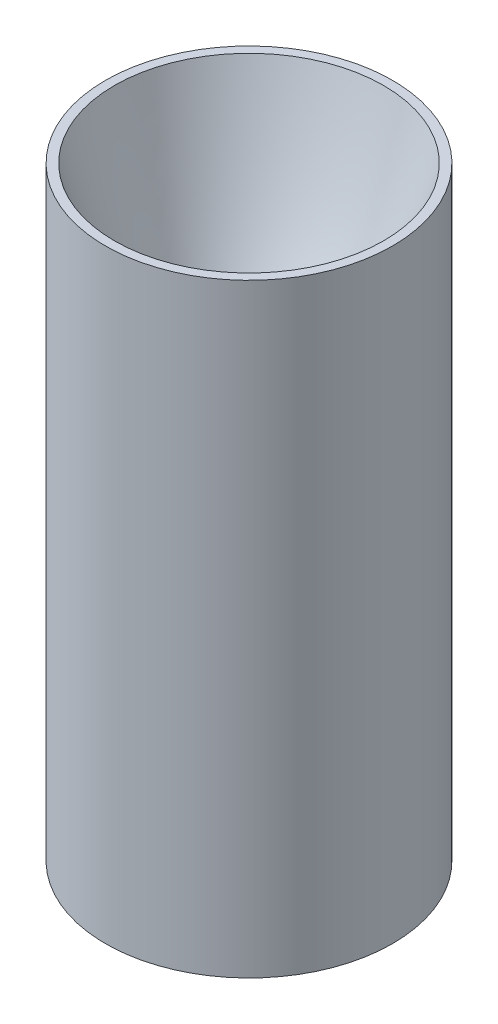
ISO-10303-21;
HEADER;
FILE_DESCRIPTION(('STEP AP214'),'2;1');
FILE_NAME('part.step','',(''),(''),'','','');
FILE_SCHEMA(('AUTOMOTIVE_DESIGN { 1 0 10303 214 1 1 1 1 }'));
ENDSEC;
DATA;
#1=APPLICATION_CONTEXT('core data for automotive mechanical design processes');
#2=APPLICATION_PROTOCOL_DEFINITION('international standard','automotive_design',2000,#1);
#3=PRODUCT_CONTEXT('',#1,'mechanical');
#4=PRODUCT('Part','Part','',(#3));
#5=PRODUCT_RELATED_PRODUCT_CATEGORY('part','',(#4));
#6=PRODUCT_DEFINITION_FORMATION('','',#4);
#7=PRODUCT_DEFINITION_CONTEXT('part definition',#1,'design');
#8=PRODUCT_DEFINITION('design','',#6,#7);
#9=PRODUCT_DEFINITION_SHAPE('','',#8);
#10=(LENGTH_UNIT() NAMED_UNIT(*) SI_UNIT(.MILLI.,.METRE.));
#11=(NAMED_UNIT(*) PLANE_ANGLE_UNIT() SI_UNIT($,.RADIAN.));
#12=(NAMED_UNIT(*) SI_UNIT($,.STERADIAN.) SOLID_ANGLE_UNIT());
#13=UNCERTAINTY_MEASURE_WITH_UNIT(LENGTH_MEASURE(1.E-05),#10,'distance_accuracy_value','');
#14=(GEOMETRIC_REPRESENTATION_CONTEXT(3) GLOBAL_UNCERTAINTY_ASSIGNED_CONTEXT((#13)) GLOBAL_UNIT_ASSIGNED_CONTEXT((#10,
#11,#12)) REPRESENTATION_CONTEXT('',''));
#15=CARTESIAN_POINT('',(0.,0.,0.));
#16=DIRECTION('',(0.,0.,1.));
#17=DIRECTION('',(1.,0.,0.));
#18=AXIS2_PLACEMENT_3D('',#15,#16,#17);
#19=CARTESIAN_POINT('',(26.7952792027638,6.50940032261705,0.));
#20=CARTESIAN_POINT('',(26.7445202608389,6.45863951352258,0.));
#21=CARTESIAN_POINT('',(26.6704420702071,6.38228245129657,0.));
#22=CARTESIAN_POINT('',(26.5045552478799,6.20880231838131,0.));
#23=CARTESIAN_POINT('',(26.3663457558084,6.0501123088261,0.));
#24=CARTESIAN_POINT('',(26.1788763741962,5.83307431955689,0.));
#25=CARTESIAN_POINT('',(26.0044054743904,5.61088821502492,0.));
#26=CARTESIAN_POINT('',(25.7917882699891,5.32567960819241,0.));
#27=CARTESIAN_POINT('',(25.6025147209982,5.0458645334822,0.));
#28=CARTESIAN_POINT('',(25.41648850457,4.75146224774109,0.));
#29=CARTESIAN_POINT('',(25.2460122224941,4.45494379501456,0.));
#30=CARTESIAN_POINT('',(25.0840703005529,4.14944285659226,0.));
#31=CARTESIAN_POINT('',(24.935285976811,3.8398274049797,0.));
#32=CARTESIAN_POINT('',(24.7971967711735,3.52378782945289,0.));
#33=CARTESIAN_POINT('',(24.6716190705559,3.20350771325653,0.));
#34=CARTESIAN_POINT('',(24.5577414131155,2.87825331698411,0.));
#35=CARTESIAN_POINT('',(24.4563235712815,2.54940009295196,0.));
#36=CARTESIAN_POINT('',(24.3671416013245,2.21651509223236,0.));
#37=CARTESIAN_POINT('',(24.2905437014453,1.88115744920019,0.));
#38=CARTESIAN_POINT('',(24.2264993053653,1.54221117006489,0.));
#39=CARTESIAN_POINT('',(24.1751847188441,1.20269794512489,0.));
#40=CARTESIAN_POINT('',(24.1414350870908,0.90159400009664,0.));
#41=CARTESIAN_POINT('',(24.1205335987741,0.646924938525799,0.));
#42=CARTESIAN_POINT('',(24.1084615678794,0.427224789349872,0.));
#43=CARTESIAN_POINT('',(24.1020237227721,0.267801741635842,0.));
#44=CARTESIAN_POINT('',(24.099606331446,0.110274361763279,0.));
#45=CARTESIAN_POINT('',(24.0990685004946,0.0360533244193808,0.));
#46=CARTESIAN_POINT('',(24.0990678740505,0.000160672239889663,0.));
#47=B_SPLINE_CURVE_WITH_KNOTS('',4,(#19,#20,#21,#22,#23,#24,#25,#26,#27,#28,#29,#30,#31,#32,#33,
#34,#35,#36,#37,#38,#39,#40,#41,#42,#43,#44,#45,#46),.UNSPECIFIED.,.F.,.F.,(5,1,1,1,1,1,1,1,1,1,
1,1,1,1,1,1,1,1,1,1,1,1,1,1,5),(0.0825688161645696,0.122284452541055,0.142142270729318,
0.162000088917581,0.201715725294151,0.241431361670644,0.281146998047181,0.320862634423759,
0.360578270800262,0.400293907176806,0.440009543553384,0.479725179929891,0.519440816306429,
0.55915645268299,0.598872089059496,0.638587725436031,0.678303361812587,0.718018998189109,
0.75773463456565,0.797450270942201,0.837165907318734,0.857023725507005,0.876881543695275,
0.896739361883545,0.916597180071815),.UNSPECIFIED.);
#48=CARTESIAN_POINT('',(-0.00553212594954357,165.815985113531,0.));
#49=DIRECTION('',(0.,1.,0.));
#50=AXIS1_PLACEMENT('',#48,#49);
#51=SURFACE_OF_REVOLUTION('',#47,#50);
#52=CARTESIAN_POINT('',(-0.00553212594953341,0.000160668806897801,0.));
#53=DIRECTION('',(0.,1.,0.));
#54=DIRECTION('',(-1.,0.,0.));
#55=AXIS2_PLACEMENT_3D('',#52,#53,#54);
#56=CIRCLE('',#55,24.1046000000001);
#57=CARTESIAN_POINT('',(-24.1101321259496,0.000160668806896325,0.));
#58=VERTEX_POINT('',#57);
#59=EDGE_CURVE('E11',#58,#58,#56,.T.);
#60=ORIENTED_EDGE('',*,*,#59,.F.);
#61=EDGE_LOOP('',(#60));
#62=FACE_BOUND('',#61,.T.);
#63=CARTESIAN_POINT('',(-0.00553212594953381,6.50940032262515,0.));
#64=DIRECTION('',(0.,1.,0.));
#65=DIRECTION('',(-1.,0.,0.));
#66=AXIS2_PLACEMENT_3D('',#63,#64,#65);
#67=CIRCLE('',#66,26.8008113287012);
#68=CARTESIAN_POINT('',(-26.8063434546508,6.50940032262515,0.));
#69=VERTEX_POINT('',#68);
#70=EDGE_CURVE('E119',#69,#69,#67,.T.);
#71=ORIENTED_EDGE('',*,*,#70,.T.);
#72=EDGE_LOOP('',(#71));
#73=FACE_BOUND('',#72,.T.);
#74=ADVANCED_FACE('F43',(#62,#73),#51,.T.);
#75=CARTESIAN_POINT('',(24.0990678740505,0.000160668806908237,0.));
#76=CARTESIAN_POINT('',(24.0990691047264,-0.0703679737352121,0.));
#77=CARTESIAN_POINT('',(24.0995982518238,-0.213423516364572,0.));
#78=CARTESIAN_POINT('',(24.1019739368555,-0.54302224256361,0.));
#79=CARTESIAN_POINT('',(24.108298330907,-0.823999723304706,0.));
#80=CARTESIAN_POINT('',(24.1177834518131,-1.19466139823137,0.));
#81=CARTESIAN_POINT('',(24.1304257444764,-1.51327438485323,0.));
#82=CARTESIAN_POINT('',(24.1462259682127,-1.86177892979882,0.));
#83=CARTESIAN_POINT('',(24.1651812265557,-2.19354619837348,0.));
#84=CARTESIAN_POINT('',(24.1928188404899,-2.61790872656857,0.));
#85=CARTESIAN_POINT('',(24.2322870469681,-3.12187327355973,0.));
#86=CARTESIAN_POINT('',(24.3032997069299,-3.87981800184723,0.));
#87=CARTESIAN_POINT('',(24.4231266778129,-4.88628971541376,0.));
#88=CARTESIAN_POINT('',(24.5994860436425,-6.05655008801696,0.));
#89=CARTESIAN_POINT('',(24.8508852327055,-7.38500574307494,0.));
#90=CARTESIAN_POINT('',(25.1517953130835,-8.7034138434872,0.));
#91=CARTESIAN_POINT('',(25.5017706231346,-10.0094765384076,0.));
#92=CARTESIAN_POINT('',(25.9003609832371,-11.3016589273833,0.));
#93=CARTESIAN_POINT('',(26.3469453915683,-12.5779386666623,0.));
#94=CARTESIAN_POINT('',(26.8410033225458,-13.8367268168494,0.));
#95=CARTESIAN_POINT('',(27.3816731216984,-15.0760364628828,0.));
#96=CARTESIAN_POINT('',(27.9684793864403,-16.2944491292128,0.));
#97=CARTESIAN_POINT('',(28.6001393975275,-17.4897781307818,0.));
#98=CARTESIAN_POINT('',(29.2765323957794,-18.6611270954326,0.));
#99=CARTESIAN_POINT('',(29.9954451018022,-19.8055827365355,0.));
#100=CARTESIAN_POINT('',(30.7580219993831,-20.9236994165562,0.));
#101=CARTESIAN_POINT('',(31.4591671926042,-21.8742511036734,0.));
#102=CARTESIAN_POINT('',(32.088736122994,-22.6732848253228,0.));
#103=CARTESIAN_POINT('',(32.6241284164022,-23.3202614843186,0.));
#104=CARTESIAN_POINT('',(33.0722557680798,-23.8398443636278,0.));
#105=CARTESIAN_POINT('',(33.5084500261274,-24.3296555943667,0.));
#106=CARTESIAN_POINT('',(33.9358261213152,-24.7883237389104,0.));
#107=CARTESIAN_POINT('',(34.2455586397423,-25.1137076600497,0.));
#108=CARTESIAN_POINT('',(34.536859957545,-25.4094883973448,0.));
#109=CARTESIAN_POINT('',(34.6364124254986,-25.5097892828568,0.));
#110=CARTESIAN_POINT('',(34.6862828032075,-25.5596614679656,0.));
#111=B_SPLINE_CURVE_WITH_KNOTS('',4,(#75,#76,#77,#78,#79,#80,#81,#82,#83,#84,#85,#86,#87,#88,
#89,#90,#91,#92,#93,#94,#95,#96,#97,#98,#99,#100,#101,#102,#103,#104,#105,#106,#107,#108,#109,
#110),.UNSPECIFIED.,.F.,.F.,(5,1,1,1,1,1,1,1,1,1,1,1,1,1,1,1,1,1,1,1,1,1,1,1,1,1,1,1,1,1,1,1,5),
(0.0826377293963901,0.0925749264345495,0.10251212335078,0.11244932026701,0.122386517183241,
0.132323714099471,0.142260911015702,0.152198107931932,0.162135304848163,0.182009698680624,
0.201884092513085,0.241632880178006,0.281381667842927,0.321130455507848,0.360879243172768,
0.400628030837689,0.44037681850261,0.480125606167531,0.519874393832452,0.559623181497373,
0.599371969162294,0.639120756827214,0.678869544492136,0.718618332157059,0.758367119821983,
0.798115907486907,0.817990301319368,0.837864695151829,0.857739088984291,0.877613482816753,
0.897487876649217,0.907425073565449,0.917362270357466),.UNSPECIFIED.);
#112=CARTESIAN_POINT('',(-0.00553212594954357,165.815985113531,0.));
#113=DIRECTION('',(0.,1.,0.));
#114=AXIS1_PLACEMENT('',#112,#113);
#115=SURFACE_OF_REVOLUTION('',#111,#114);
#116=CARTESIAN_POINT('',(-0.00553212594953185,-25.5596614655476,0.));
#117=DIRECTION('',(0.,1.,0.));
#118=DIRECTION('',(-1.,0.,0.));
#119=AXIS2_PLACEMENT_3D('',#116,#117,#118);
#120=CIRCLE('',#119,34.6918149267068);
#121=CARTESIAN_POINT('',(-34.6973470526563,-25.5596614655476,0.));
#122=VERTEX_POINT('',#121);
#123=EDGE_CURVE('E52',#122,#122,#120,.T.);
#124=ORIENTED_EDGE('',*,*,#123,.F.);
#125=EDGE_LOOP('',(#124));
#126=FACE_BOUND('',#125,.T.);
#127=ORIENTED_EDGE('',*,*,#59,.T.);
#128=EDGE_LOOP('',(#127));
#129=FACE_BOUND('',#128,.T.);
#130=ADVANCED_FACE('F138',(#126,#129),#115,.T.);
#131=CARTESIAN_POINT('',(-0.00553212594953185,-25.5596614655476,0.));
#132=DIRECTION('',(0.,-1.,0.));
#133=DIRECTION('',(1.,0.,0.));
#134=AXIS2_PLACEMENT_3D('',#131,#132,#133);
#135=CONICAL_SURFACE('',#134,34.6918149267068,0.785398163436923);
#136=CARTESIAN_POINT('',(-0.00553212594953132,-34.1672896564155,0.));
#137=DIRECTION('',(0.,1.,0.));
#138=DIRECTION('',(-1.,0.,0.));
#139=AXIS2_PLACEMENT_3D('',#136,#137,#138);
#140=CIRCLE('',#139,43.2994431182542);
#141=CARTESIAN_POINT('',(-43.3049752442037,-34.1672896564155,0.));
#142=VERTEX_POINT('',#141);
#143=EDGE_CURVE('E196',#142,#142,#140,.T.);
#144=ORIENTED_EDGE('',*,*,#143,.F.);
#145=EDGE_LOOP('',(#144));
#146=FACE_BOUND('',#145,.T.);
#147=ORIENTED_EDGE('',*,*,#123,.T.);
#148=EDGE_LOOP('',(#147));
#149=FACE_BOUND('',#148,.T.);
#150=ADVANCED_FACE('F141',(#146,#149),#135,.F.);
#151=CARTESIAN_POINT('',(43.2939109923046,-34.1672896564155,0.));
#152=CARTESIAN_POINT('',(43.3437831513223,-34.2171620551714,0.));
#153=CARTESIAN_POINT('',(43.4443920727492,-34.3185162876524,0.));
#154=CARTESIAN_POINT('',(43.6740724065625,-34.5515494508273,0.));
#155=CARTESIAN_POINT('',(43.8739246242924,-34.7603401511495,0.));
#156=CARTESIAN_POINT('',(44.1814575029394,-35.0846311851452,0.));
#157=CARTESIAN_POINT('',(44.5147761897921,-35.4469926571794,0.));
#158=CARTESIAN_POINT('',(44.9151269482091,-35.8942476326121,0.));
#159=CARTESIAN_POINT('',(45.3528176805606,-36.4033812820872,0.));
#160=CARTESIAN_POINT('',(45.8935379372936,-37.0556721225026,0.));
#161=CARTESIAN_POINT('',(46.5198690603663,-37.8514517850733,0.));
#162=CARTESIAN_POINT('',(47.2231021380089,-38.8040762391045,0.));
#163=CARTESIAN_POINT('',(47.9844755196269,-39.9209726571504,0.));
#164=CARTESIAN_POINT('',(48.7041252288017,-41.0661548789494,0.));
#165=CARTESIAN_POINT('',(49.3801202305322,-42.237093238969,0.));
#166=CARTESIAN_POINT('',(50.0120609277141,-43.4327015259013,0.));
#167=CARTESIAN_POINT('',(50.5987337525416,-44.6509688035954,0.));
#168=CARTESIAN_POINT('',(51.1395203608935,-45.8904084054128,0.));
#169=CARTESIAN_POINT('',(51.6335378309109,-47.1491350671244,0.));
#170=CARTESIAN_POINT('',(52.0243487391707,-48.2659692236755,0.));
#171=CARTESIAN_POINT('',(52.3292893402464,-49.2330777402432,0.));
#172=CARTESIAN_POINT('',(52.6100142242714,-50.2074890382386,0.));
#173=CARTESIAN_POINT('',(52.8663751202277,-51.1885390834316,0.));
#174=CARTESIAN_POINT('',(53.0920641868644,-52.1774428213628,0.));
#175=CARTESIAN_POINT('',(53.286810822161,-53.1724252398257,0.));
#176=CARTESIAN_POINT('',(53.4566757862888,-54.1724354302666,0.));
#177=CARTESIAN_POINT('',(53.5774268613503,-55.0081658604085,0.));
#178=CARTESIAN_POINT('',(53.6772884517024,-55.8484803658293,0.));
#179=CARTESIAN_POINT('',(53.7561931214081,-56.6879981651896,0.));
#180=CARTESIAN_POINT('',(53.8004052846286,-57.2809598991543,0.));
#181=CARTESIAN_POINT('',(53.8304176255881,-57.78159444267,0.));
#182=CARTESIAN_POINT('',(53.8501684533724,-58.2128376217517,0.));
#183=CARTESIAN_POINT('',(53.8628113509311,-58.532567487684,0.));
#184=CARTESIAN_POINT('',(53.8722968380062,-58.9047954926748,0.));
#185=CARTESIAN_POINT('',(53.8786214368661,-59.1815646164516,0.));
#186=CARTESIAN_POINT('',(53.8809972871444,-59.5154061029223,0.));
#187=CARTESIAN_POINT('',(53.8815264301114,-59.6569831565778,0.));
#188=CARTESIAN_POINT('',(53.881527661459,-59.7275132097554,0.));
#189=B_SPLINE_CURVE_WITH_KNOTS('',4,(#151,#152,#153,#154,#155,#156,#157,#158,#159,#160,#161,
#162,#163,#164,#165,#166,#167,#168,#169,#170,#171,#172,#173,#174,#175,#176,#177,#178,#179,#180,
#181,#182,#183,#184,#185,#186,#187,#188),.UNSPECIFIED.,.F.,.F.,(5,1,1,1,1,1,1,1,1,1,1,1,1,1,1,1,
1,1,1,1,1,1,1,1,1,1,1,1,1,1,1,1,1,1,5),(0.0826377290758682,0.092574925554141,0.102512122470373,
0.112449319386606,0.122386516302838,0.142260910135299,0.162135303967759,0.18200969780022,
0.201884091632681,0.241632879297603,0.281381666962524,0.321130454627446,0.360879242292367,
0.400628029957289,0.440376817622211,0.480125605287132,0.519874392952054,0.559623180616974,
0.599371968281896,0.619246362114357,0.639120755946818,0.67886954361174,0.718618331276661,
0.738492725109122,0.758367118941582,0.798115906606503,0.817990300438964,0.837864694271425,
0.857739088103886,0.867676285020117,0.877613481936347,0.887550678852578,0.897487875768808,
0.907425072685039,0.917362270043718),.UNSPECIFIED.);
#190=CARTESIAN_POINT('',(-0.00553212594954357,165.815985113531,0.));
#191=DIRECTION('',(0.,1.,0.));
#192=AXIS1_PLACEMENT('',#190,#191);
#193=SURFACE_OF_REVOLUTION('',#189,#192);
#194=CARTESIAN_POINT('',(-0.00553212594952976,-59.7275132222084,0.));
#195=DIRECTION('',(0.,1.,0.));
#196=DIRECTION('',(-1.,0.,0.));
#197=AXIS2_PLACEMENT_3D('',#194,#195,#196);
#198=CIRCLE('',#197,53.8870597874087);
#199=CARTESIAN_POINT('',(-53.8925919133582,-59.7275132222084,0.));
#200=VERTEX_POINT('',#199);
#201=EDGE_CURVE('E193',#200,#200,#198,.T.);
#202=ORIENTED_EDGE('',*,*,#201,.F.);
#203=EDGE_LOOP('',(#202));
#204=FACE_BOUND('',#203,.T.);
#205=ORIENTED_EDGE('',*,*,#143,.T.);
#206=EDGE_LOOP('',(#205));
#207=FACE_BOUND('',#206,.T.);
#208=ADVANCED_FACE('F145',(#204,#207),#193,.T.);
#209=CARTESIAN_POINT('',(-0.00553212594954357,165.815985113531,0.));
#210=DIRECTION('',(0.,1.,0.));
#211=DIRECTION('',(-1.,0.,0.));
#212=AXIS2_PLACEMENT_3D('',#209,#210,#211);
#213=CYLINDRICAL_SURFACE('',#212,53.8870597874087);
#214=CARTESIAN_POINT('',(-0.00553212594952042,-212.127513222208,0.));
#215=DIRECTION('',(0.,1.,0.));
#216=DIRECTION('',(-1.,0.,0.));
#217=AXIS2_PLACEMENT_3D('',#214,#215,#216);
#218=CIRCLE('',#217,53.8870597874087);
#219=CARTESIAN_POINT('',(-53.8925919133582,-212.127513222208,0.));
#220=VERTEX_POINT('',#219);
#221=EDGE_CURVE('E190',#220,#220,#218,.T.);
#222=ORIENTED_EDGE('',*,*,#221,.F.);
#223=EDGE_LOOP('',(#222));
#224=FACE_BOUND('',#223,.T.);
#225=ORIENTED_EDGE('',*,*,#201,.T.);
#226=EDGE_LOOP('',(#225));
#227=FACE_BOUND('',#226,.T.);
#228=ADVANCED_FACE('F149',(#224,#227),#213,.F.);
#229=CARTESIAN_POINT('',(76.4900236023066,-212.127513222208,0.));
#230=DIRECTION('',(0.,1.,0.));
#231=DIRECTION('',(-1.,0.,0.));
#232=AXIS2_PLACEMENT_3D('',#229,#230,#231);
#233=PLANE('',#232);
#234=CARTESIAN_POINT('',(46.1032838079609,-212.127513222208,46.1035512337718));
#235=DIRECTION('',(0.,1.,0.));
#236=DIRECTION('',(0.38268343232144,0.,-0.923879532529367));
#237=AXIS2_PLACEMENT_3D('',#234,#235,#236);
#238=ELLIPSE('',#237,4.21640000033001,4.21639999999999);
#239=CARTESIAN_POINT('',(47.7168302321273,-212.127513222208,42.20810557251));
#240=VERTEX_POINT('',#239);
#241=EDGE_CURVE('E47',#240,#240,#238,.T.);
#242=ORIENTED_EDGE('',*,*,#241,.T.);
#243=EDGE_LOOP('',(#242));
#244=FACE_BOUND('',#243,.T.);
#245=CARTESIAN_POINT('',(-0.000267431971473179,-212.127513222208,65.2002674406839));
#246=DIRECTION('',(0.,1.,0.));
#247=DIRECTION('',(0.707106781139304,0.,-0.707106781233791));
#248=AXIS2_PLACEMENT_3D('',#245,#246,#247);
#249=ELLIPSE('',#248,4.21640000112674,4.21639999999999);
#250=CARTESIAN_POINT('',(2.98117760082102,-212.127513222208,62.2188224074931));
#251=VERTEX_POINT('',#250);
#252=EDGE_CURVE('E93',#251,#251,#249,.T.);
#253=ORIENTED_EDGE('',*,*,#252,.T.);
#254=EDGE_LOOP('',(#253));
#255=FACE_BOUND('',#254,.T.);
#256=CARTESIAN_POINT('',(-46.1038186893277,-212.127513222208,46.1035512511962));
#257=DIRECTION('',(0.,1.,0.));
#258=DIRECTION('',(0.923879532493207,0.,-0.382683432408738));
#259=AXIS2_PLACEMENT_3D('',#256,#257,#258);
#260=ELLIPSE('',#259,4.21640000192348,4.21639999999999);
#261=CARTESIAN_POINT('',(-42.2083730267463,-212.127513222208,44.4900048260519));
#262=VERTEX_POINT('',#261);
#263=EDGE_CURVE('E97',#262,#262,#260,.T.);
#264=ORIENTED_EDGE('',*,*,#263,.T.);
#265=EDGE_LOOP('',(#264));
#266=FACE_BOUND('',#265,.T.);
#267=CARTESIAN_POINT('',(-65.2005348987914,-212.127513222208,0.));
#268=DIRECTION('',(0.,1.,0.));
#269=DIRECTION('',(1.,0.,0.));
#270=AXIS2_PLACEMENT_3D('',#267,#268,#269);
#271=ELLIPSE('',#270,4.21640000225349,4.21639999999999);
#272=CARTESIAN_POINT('',(-60.9841348965379,-212.127513222208,0.));
#273=VERTEX_POINT('',#272);
#274=EDGE_CURVE('E101',#273,#273,#271,.T.);
#275=ORIENTED_EDGE('',*,*,#274,.T.);
#276=EDGE_LOOP('',(#275));
#277=FACE_BOUND('',#276,.T.);
#278=CARTESIAN_POINT('',(-46.1038186893284,-212.127513222208,-46.1035512511956));
#279=DIRECTION('',(0.,1.,0.));
#280=DIRECTION('',(0.92387953249321,0.,0.382683432408731));
#281=AXIS2_PLACEMENT_3D('',#278,#279,#280);
#282=ELLIPSE('',#281,4.21640000192348,4.21639999999999);
#283=CARTESIAN_POINT('',(-42.2083730267469,-212.127513222208,-44.4900048260513));
#284=VERTEX_POINT('',#283);
#285=EDGE_CURVE('E105',#284,#284,#282,.T.);
#286=ORIENTED_EDGE('',*,*,#285,.T.);
#287=EDGE_LOOP('',(#286));
#288=FACE_BOUND('',#287,.T.);
#289=CARTESIAN_POINT('',(-0.000267431972383761,-212.127513222208,-65.2002674406839));
#290=DIRECTION('',(0.,1.,0.));
#291=DIRECTION('',(0.707106781139309,0.,0.707106781233786));
#292=AXIS2_PLACEMENT_3D('',#289,#290,#291);
#293=ELLIPSE('',#292,4.21640000112674,4.21639999999999);
#294=CARTESIAN_POINT('',(2.98117760082012,-212.127513222208,-62.2188224074931));
#295=VERTEX_POINT('',#294);
#296=EDGE_CURVE('E109',#295,#295,#293,.T.);
#297=ORIENTED_EDGE('',*,*,#296,.T.);
#298=EDGE_LOOP('',(#297));
#299=FACE_BOUND('',#298,.T.);
#300=CARTESIAN_POINT('',(46.1032838079602,-212.127513222208,-46.1035512337724));
#301=DIRECTION('',(0.,1.,0.));
#302=DIRECTION('',(0.382683432321446,0.,0.923879532529364));
#303=AXIS2_PLACEMENT_3D('',#300,#301,#302);
#304=ELLIPSE('',#303,4.21640000033001,4.21639999999999);
#305=CARTESIAN_POINT('',(47.7168302321267,-212.127513222208,-42.2081055725107));
#306=VERTEX_POINT('',#305);
#307=EDGE_CURVE('E113',#306,#306,#304,.T.);
#308=ORIENTED_EDGE('',*,*,#307,.T.);
#309=EDGE_LOOP('',(#308));
#310=FACE_BOUND('',#309,.T.);
#311=CARTESIAN_POINT('',(65.2,-212.127513222208,0.));
#312=DIRECTION('',(0.,-1.,0.));
#313=DIRECTION('',(0.,0.,-1.));
#314=AXIS2_PLACEMENT_3D('',#311,#312,#313);
#315=CIRCLE('',#314,4.21639999999999);
#316=CARTESIAN_POINT('',(65.2,-212.127513222208,-4.21639999999999));
#317=VERTEX_POINT('',#316);
#318=EDGE_CURVE('E114',#317,#317,#315,.T.);
#319=ORIENTED_EDGE('',*,*,#318,.F.);
#320=EDGE_LOOP('',(#319));
#321=FACE_BOUND('',#320,.T.);
#322=CARTESIAN_POINT('',(-0.00553212594952042,-212.127513222208,0.));
#323=DIRECTION('',(0.,1.,0.));
#324=DIRECTION('',(-1.,0.,0.));
#325=AXIS2_PLACEMENT_3D('',#322,#323,#324);
#326=CIRCLE('',#325,76.4955557282561);
#327=CARTESIAN_POINT('',(-76.5010878542056,-212.127513222208,0.));
#328=VERTEX_POINT('',#327);
#329=EDGE_CURVE('E187',#328,#328,#326,.T.);
#330=ORIENTED_EDGE('',*,*,#329,.F.);
#331=EDGE_LOOP('',(#330));
#332=FACE_BOUND('',#331,.T.);
#333=ORIENTED_EDGE('',*,*,#221,.T.);
#334=EDGE_LOOP('',(#333));
#335=FACE_BOUND('',#334,.T.);
#336=ADVANCED_FACE('F153',(#244,#255,#266,#277,#288,#299,#310,#321,#332,#335),#233,.F.);
#337=CARTESIAN_POINT('',(-0.00553212594954357,165.815985113531,0.));
#338=DIRECTION('',(0.,1.,0.));
#339=DIRECTION('',(-1.,0.,0.));
#340=AXIS2_PLACEMENT_3D('',#337,#338,#339);
#341=CYLINDRICAL_SURFACE('',#340,76.4955557282561);
#342=CARTESIAN_POINT('',(-0.00553212594954014,109.927507640521,0.));
#343=DIRECTION('',(0.,1.,0.));
#344=DIRECTION('',(-1.,0.,0.));
#345=AXIS2_PLACEMENT_3D('',#342,#343,#344);
#346=CIRCLE('',#345,76.4955557282561);
#347=CARTESIAN_POINT('',(-76.5010878542057,109.927507640521,0.));
#348=VERTEX_POINT('',#347);
#349=EDGE_CURVE('E184',#348,#348,#346,.T.);
#350=ORIENTED_EDGE('',*,*,#349,.F.);
#351=EDGE_LOOP('',(#350));
#352=FACE_BOUND('',#351,.T.);
#353=ORIENTED_EDGE('',*,*,#329,.T.);
#354=EDGE_LOOP('',(#353));
#355=FACE_BOUND('',#354,.T.);
#356=ADVANCED_FACE('F157',(#352,#355),#341,.T.);
#357=CARTESIAN_POINT('',(71.7275236023065,109.927507640521,0.));
#358=DIRECTION('',(0.,-1.,0.));
#359=DIRECTION('',(1.,0.,0.));
#360=AXIS2_PLACEMENT_3D('',#357,#358,#359);
#361=PLANE('',#360);
#362=CARTESIAN_POINT('',(-0.00553212594954014,109.927507640521,0.));
#363=DIRECTION('',(0.,1.,0.));
#364=DIRECTION('',(-1.,0.,0.));
#365=AXIS2_PLACEMENT_3D('',#362,#363,#364);
#366=CIRCLE('',#365,71.7330557282561);
#367=CARTESIAN_POINT('',(-71.7385878542057,109.927507640521,0.));
#368=VERTEX_POINT('',#367);
#369=EDGE_CURVE('E181',#368,#368,#366,.T.);
#370=ORIENTED_EDGE('',*,*,#369,.F.);
#371=EDGE_LOOP('',(#370));
#372=FACE_BOUND('',#371,.T.);
#373=ORIENTED_EDGE('',*,*,#349,.T.);
#374=EDGE_LOOP('',(#373));
#375=FACE_BOUND('',#374,.T.);
#376=ADVANCED_FACE('F161',(#372,#375),#361,.F.);
#377=CARTESIAN_POINT('',(71.7275236023066,109.927507640521,0.));
#378=CARTESIAN_POINT('',(49.2614014026307,34.6361148417855,0.));
#379=CARTESIAN_POINT('',(26.7952792027517,6.50940032262514,0.));
#380=B_SPLINE_CURVE_WITH_KNOTS('',2,(#377,#378,#379),.UNSPECIFIED.,.F.,.F.,(3,3),(0.,1.),.UNSPECIFIED.);
#381=CARTESIAN_POINT('',(-0.00553212594954357,165.815985113531,0.));
#382=DIRECTION('',(0.,1.,0.));
#383=AXIS1_PLACEMENT('',#381,#382);
#384=SURFACE_OF_REVOLUTION('',#380,#383);
#385=ORIENTED_EDGE('',*,*,#70,.F.);
#386=EDGE_LOOP('',(#385));
#387=FACE_BOUND('',#386,.T.);
#388=ORIENTED_EDGE('',*,*,#369,.T.);
#389=EDGE_LOOP('',(#388));
#390=FACE_BOUND('',#389,.T.);
#391=ADVANCED_FACE('F165',(#387,#390),#384,.T.);
#392=CARTESIAN_POINT('',(65.2,-187.127513222208,0.));
#393=DIRECTION('',(0.,-1.,0.));
#394=DIRECTION('',(0.,0.,-1.));
#395=AXIS2_PLACEMENT_3D('',#392,#393,#394);
#396=CONICAL_SURFACE('',#395,4.21639999999999,1.02974425867665);
#397=CARTESIAN_POINT('',(65.2,-184.594044508141,0.));
#398=VERTEX_POINT('',#397);
#399=VERTEX_LOOP('',#398);
#400=FACE_BOUND('',#399,.T.);
#401=CARTESIAN_POINT('',(65.2,-187.127513222208,0.));
#402=DIRECTION('',(0.,-1.,0.));
#403=DIRECTION('',(0.,0.,-1.));
#404=AXIS2_PLACEMENT_3D('',#401,#402,#403);
#405=CIRCLE('',#404,4.21639999999999);
#406=CARTESIAN_POINT('',(65.2,-187.127513222208,-4.21639999999999));
#407=VERTEX_POINT('',#406);
#408=EDGE_CURVE('E117',#407,#407,#405,.T.);
#409=ORIENTED_EDGE('',*,*,#408,.T.);
#410=EDGE_LOOP('',(#409));
#411=FACE_BOUND('',#410,.T.);
#412=ADVANCED_FACE('F169',(#400,#411),#396,.F.);
#413=CARTESIAN_POINT('',(65.2,-212.127513222208,0.));
#414=DIRECTION('',(0.,-1.,0.));
#415=DIRECTION('',(0.,0.,-1.));
#416=AXIS2_PLACEMENT_3D('',#413,#414,#415);
#417=CYLINDRICAL_SURFACE('',#416,4.21639999999999);
#418=ORIENTED_EDGE('',*,*,#408,.F.);
#419=EDGE_LOOP('',(#418));
#420=FACE_BOUND('',#419,.T.);
#421=ORIENTED_EDGE('',*,*,#318,.T.);
#422=EDGE_LOOP('',(#421));
#423=FACE_BOUND('',#422,.T.);
#424=ADVANCED_FACE('F294',(#420,#423),#417,.F.);
#425=CARTESIAN_POINT('',(46.1032838094549,-212.127825399818,-46.1035512301639));
#426=DIRECTION('',(4.78798051518147E-06,-0.99999999992173,1.15592074975258E-05));
#427=DIRECTION('',(0.,-1.15592074976583E-05,-0.999999999933193));
#428=AXIS2_PLACEMENT_3D('',#425,#426,#427);
#429=CYLINDRICAL_SURFACE('',#428,4.21639999999999);
#430=CARTESIAN_POINT('',(46.103164109942,-187.127825401775,-46.1038402103513));
#431=DIRECTION('',(4.78798051518147E-06,-0.99999999992173,1.15592074975258E-05));
#432=DIRECTION('',(0.,-1.15592074976583E-05,-0.999999999933193));
#433=AXIS2_PLACEMENT_3D('',#430,#431,#432);
#434=CIRCLE('',#433,4.2164);
#435=CARTESIAN_POINT('',(46.103164109942,-187.127874140018,-50.3202402100696));
#436=VERTEX_POINT('',#435);
#437=EDGE_CURVE('E110',#436,#436,#434,.T.);
#438=ORIENTED_EDGE('',*,*,#437,.F.);
#439=EDGE_LOOP('',(#438));
#440=FACE_BOUND('',#439,.T.);
#441=ORIENTED_EDGE('',*,*,#307,.F.);
#442=EDGE_LOOP('',(#441));
#443=FACE_BOUND('',#442,.T.);
#444=ADVANCED_FACE('F300',(#440,#443),#429,.F.);
#445=CARTESIAN_POINT('',(46.103164109942,-187.127825401775,-46.1038402103513));
#446=DIRECTION('',(4.78798051518147E-06,-0.99999999992173,1.15592074975258E-05));
#447=DIRECTION('',(0.,-1.15592074976583E-05,-0.999999999933193));
#448=AXIS2_PLACEMENT_3D('',#445,#446,#447);
#449=CONICAL_SURFACE('',#448,4.2164,1.02974425867665);
#450=CARTESIAN_POINT('',(46.1031519797432,-184.594356687906,-46.1038694952419));
#451=VERTEX_POINT('',#450);
#452=VERTEX_LOOP('',#451);
#453=FACE_BOUND('',#452,.T.);
#454=ORIENTED_EDGE('',*,*,#437,.T.);
#455=EDGE_LOOP('',(#454));
#456=FACE_BOUND('',#455,.T.);
#457=ADVANCED_FACE('F308',(#453,#456),#449,.F.);
#458=CARTESIAN_POINT('',(-0.000267414548880048,-212.128579063238,-65.2002674232604));
#459=DIRECTION('',(1.63471880111628E-05,-0.99999999973277,1.63471880132858E-05));
#460=DIRECTION('',(0.,-1.634718801547E-05,-0.999999999866385));
#461=AXIS2_PLACEMENT_3D('',#458,#459,#460);
#462=CYLINDRICAL_SURFACE('',#461,4.21639999999999);
#463=CARTESIAN_POINT('',(-0.000676094249159119,-187.128579069919,-65.2006761029608));
#464=DIRECTION('',(1.63471880111628E-05,-0.99999999973277,1.63471880132858E-05));
#465=DIRECTION('',(0.,-1.634718801547E-05,-0.999999999866385));
#466=AXIS2_PLACEMENT_3D('',#463,#464,#465);
#467=CIRCLE('',#466,4.2164);
#468=CARTESIAN_POINT('',(-0.000676094249159119,-187.128647996203,-69.4170761023974));
#469=VERTEX_POINT('',#468);
#470=EDGE_CURVE('E106',#469,#469,#467,.T.);
#471=ORIENTED_EDGE('',*,*,#470,.F.);
#472=EDGE_LOOP('',(#471));
#473=FACE_BOUND('',#472,.T.);
#474=ORIENTED_EDGE('',*,*,#296,.F.);
#475=EDGE_LOOP('',(#474));
#476=FACE_BOUND('',#475,.T.);
#477=ADVANCED_FACE('F317',(#473,#476),#462,.F.);
#478=CARTESIAN_POINT('',(-0.000676094249159119,-187.128579069919,-65.2006761029608));
#479=DIRECTION('',(1.63471880111628E-05,-0.99999999973277,1.63471880132858E-05));
#480=DIRECTION('',(0.,-1.634718801547E-05,-0.999999999866385));
#481=AXIS2_PLACEMENT_3D('',#478,#479,#480);
#482=CONICAL_SURFACE('',#481,4.2164,1.02974425867666);
#483=CARTESIAN_POINT('',(-0.000717509338553153,-184.595110356528,-65.2007175180502));
#484=VERTEX_POINT('',#483);
#485=VERTEX_LOOP('',#484);
#486=FACE_BOUND('',#485,.T.);
#487=ORIENTED_EDGE('',*,*,#470,.T.);
#488=EDGE_LOOP('',(#487));
#489=FACE_BOUND('',#488,.T.);
#490=ADVANCED_FACE('F325',(#486,#489),#482,.F.);
#491=CARTESIAN_POINT('',(-46.1038186385525,-212.129332726659,-46.1035512301636));
#492=DIRECTION('',(2.79063955071442E-05,-0.999999999543809,1.15592074975258E-05));
#493=DIRECTION('',(0.999999999610617,2.79063955090085E-05,0.));
#494=AXIS2_PLACEMENT_3D('',#491,#492,#493);
#495=CYLINDRICAL_SURFACE('',#494,4.21639999999999);
#496=CARTESIAN_POINT('',(-46.1045162984402,-187.129332738063,-46.103840210351));
#497=DIRECTION('',(2.79063955071442E-05,-0.999999999543809,1.15592074975258E-05));
#498=DIRECTION('',(0.999999999610617,2.79063955090085E-05,0.));
#499=AXIS2_PLACEMENT_3D('',#496,#497,#498);
#500=CIRCLE('',#499,4.21639999999999);
#501=CARTESIAN_POINT('',(-41.888116300082,-187.129215073537,-46.103840210351));
#502=VERTEX_POINT('',#501);
#503=EDGE_CURVE('E102',#502,#502,#500,.T.);
#504=ORIENTED_EDGE('',*,*,#503,.F.);
#505=EDGE_LOOP('',(#504));
#506=FACE_BOUND('',#505,.T.);
#507=ORIENTED_EDGE('',*,*,#285,.F.);
#508=EDGE_LOOP('',(#507));
#509=FACE_BOUND('',#508,.T.);
#510=ADVANCED_FACE('F335',(#506,#509),#495,.F.);
#511=CARTESIAN_POINT('',(-46.1045162984402,-187.129332738063,-46.103840210351));
#512=DIRECTION('',(2.79063955071442E-05,-0.999999999543809,1.15592074975258E-05));
#513=DIRECTION('',(0.999999999610617,2.79063955090085E-05,0.));
#514=AXIS2_PLACEMENT_3D('',#511,#512,#513);
#515=CONICAL_SURFACE('',#514,4.21639999999999,1.02974425867666);
#516=CARTESIAN_POINT('',(-46.1045869984202,-184.595864025151,-46.1038694952416));
#517=VERTEX_POINT('',#516);
#518=VERTEX_LOOP('',#517);
#519=FACE_BOUND('',#518,.T.);
#520=ORIENTED_EDGE('',*,*,#503,.T.);
#521=EDGE_LOOP('',(#520));
#522=FACE_BOUND('',#521,.T.);
#523=ADVANCED_FACE('F343',(#519,#522),#515,.F.);
#524=CARTESIAN_POINT('',(-65.2005348290974,-212.129644904269,0.));
#525=DIRECTION('',(3.26943760222643E-05,-0.999999999465539,0.));
#526=DIRECTION('',(0.999999999465539,3.26943760222643E-05,0.));
#527=AXIS2_PLACEMENT_3D('',#524,#525,#526);
#528=CYLINDRICAL_SURFACE('',#527,4.21639999999999);
#529=CARTESIAN_POINT('',(-65.2013521884979,-187.12964491763,0.));
#530=DIRECTION('',(3.26943760222643E-05,-0.999999999465539,0.));
#531=DIRECTION('',(0.999999999465539,3.26943760222643E-05,0.));
#532=AXIS2_PLACEMENT_3D('',#529,#530,#531);
#533=CIRCLE('',#532,4.21639999999999);
#534=CARTESIAN_POINT('',(-60.9849521907514,-187.129507065063,0.));
#535=VERTEX_POINT('',#534);
#536=EDGE_CURVE('E98',#535,#535,#533,.T.);
#537=ORIENTED_EDGE('',*,*,#536,.F.);
#538=EDGE_LOOP('',(#537));
#539=FACE_BOUND('',#538,.T.);
#540=ORIENTED_EDGE('',*,*,#274,.F.);
#541=EDGE_LOOP('',(#540));
#542=FACE_BOUND('',#541,.T.);
#543=ADVANCED_FACE('F351',(#539,#542),#528,.F.);
#544=CARTESIAN_POINT('',(-65.2013521884979,-187.12964491763,0.));
#545=DIRECTION('',(3.26943760222643E-05,-0.999999999465539,0.));
#546=DIRECTION('',(0.999999999465539,3.26943760222643E-05,0.));
#547=AXIS2_PLACEMENT_3D('',#544,#545,#546);
#548=CONICAL_SURFACE('',#547,4.21639999999999,1.02974425867665);
#549=CARTESIAN_POINT('',(-65.2014350186767,-184.596176204916,0.));
#550=VERTEX_POINT('',#549);
#551=VERTEX_LOOP('',#550);
#552=FACE_BOUND('',#551,.T.);
#553=ORIENTED_EDGE('',*,*,#536,.T.);
#554=EDGE_LOOP('',(#553));
#555=FACE_BOUND('',#554,.T.);
#556=ADVANCED_FACE('F359',(#552,#555),#548,.F.);
#557=CARTESIAN_POINT('',(-46.1038186385519,-212.129332726659,46.1035512301642));
#558=DIRECTION('',(2.7906395507144E-05,-0.999999999543809,-1.15592074975259E-05));
#559=DIRECTION('',(0.999999999610617,2.79063955090084E-05,0.));
#560=AXIS2_PLACEMENT_3D('',#557,#558,#559);
#561=CYLINDRICAL_SURFACE('',#560,4.21639999999999);
#562=CARTESIAN_POINT('',(-46.1045162984396,-187.129332738063,46.1038402103516));
#563=DIRECTION('',(2.7906395507144E-05,-0.999999999543809,-1.15592074975259E-05));
#564=DIRECTION('',(0.999999999610617,2.79063955090084E-05,0.));
#565=AXIS2_PLACEMENT_3D('',#562,#563,#564);
#566=CIRCLE('',#565,4.2164);
#567=CARTESIAN_POINT('',(-41.8881163000814,-187.129215073537,46.1038402103516));
#568=VERTEX_POINT('',#567);
#569=EDGE_CURVE('E94',#568,#568,#566,.T.);
#570=ORIENTED_EDGE('',*,*,#569,.F.);
#571=EDGE_LOOP('',(#570));
#572=FACE_BOUND('',#571,.T.);
#573=ORIENTED_EDGE('',*,*,#263,.F.);
#574=EDGE_LOOP('',(#573));
#575=FACE_BOUND('',#574,.T.);
#576=ADVANCED_FACE('F227',(#572,#575),#561,.F.);
#577=CARTESIAN_POINT('',(-46.1045162984396,-187.129332738063,46.1038402103516));
#578=DIRECTION('',(2.7906395507144E-05,-0.999999999543809,-1.15592074975259E-05));
#579=DIRECTION('',(0.999999999610617,2.79063955090084E-05,0.));
#580=AXIS2_PLACEMENT_3D('',#577,#578,#579);
#581=CONICAL_SURFACE('',#580,4.2164,1.02974425867666);
#582=CARTESIAN_POINT('',(-46.1045869984195,-184.595864025151,46.1038694952422));
#583=VERTEX_POINT('',#582);
#584=VERTEX_LOOP('',#583);
#585=FACE_BOUND('',#584,.T.);
#586=ORIENTED_EDGE('',*,*,#569,.T.);
#587=EDGE_LOOP('',(#586));
#588=FACE_BOUND('',#587,.T.);
#589=ADVANCED_FACE('F218',(#585,#588),#581,.F.);
#590=CARTESIAN_POINT('',(-0.000267414547969466,-212.128579063238,65.2002674232604));
#591=DIRECTION('',(1.63471880111626E-05,-0.99999999973277,-1.63471880132858E-05));
#592=DIRECTION('',(0.,1.634718801547E-05,-0.999999999866385));
#593=AXIS2_PLACEMENT_3D('',#590,#591,#592);
#594=CYLINDRICAL_SURFACE('',#593,4.21639999999999);
#595=CARTESIAN_POINT('',(-0.000676094248248531,-187.128579069919,65.2006761029608));
#596=DIRECTION('',(1.63471880111626E-05,-0.99999999973277,-1.63471880132858E-05));
#597=DIRECTION('',(0.,1.634718801547E-05,-0.999999999866385));
#598=AXIS2_PLACEMENT_3D('',#595,#596,#597);
#599=CIRCLE('',#598,4.21639999999999);
#600=CARTESIAN_POINT('',(-0.000676094248248531,-187.128510143636,60.9842761035241));
#601=VERTEX_POINT('',#600);
#602=EDGE_CURVE('E89',#601,#601,#599,.T.);
#603=ORIENTED_EDGE('',*,*,#602,.F.);
#604=EDGE_LOOP('',(#603));
#605=FACE_BOUND('',#604,.T.);
#606=ORIENTED_EDGE('',*,*,#252,.F.);
#607=EDGE_LOOP('',(#606));
#608=FACE_BOUND('',#607,.T.);
#609=ADVANCED_FACE('F215',(#605,#608),#594,.F.);
#610=CARTESIAN_POINT('',(-0.000676094248248531,-187.128579069919,65.2006761029608));
#611=DIRECTION('',(1.63471880111626E-05,-0.99999999973277,-1.63471880132858E-05));
#612=DIRECTION('',(0.,1.634718801547E-05,-0.999999999866385));
#613=AXIS2_PLACEMENT_3D('',#610,#611,#612);
#614=CONICAL_SURFACE('',#613,4.21639999999999,1.02974425867665);
#615=CARTESIAN_POINT('',(-0.000717509337642564,-184.595110356528,65.2007175180502));
#616=VERTEX_POINT('',#615);
#617=VERTEX_LOOP('',#616);
#618=FACE_BOUND('',#617,.T.);
#619=ORIENTED_EDGE('',*,*,#602,.T.);
#620=EDGE_LOOP('',(#619));
#621=FACE_BOUND('',#620,.T.);
#622=ADVANCED_FACE('F217',(#618,#621),#614,.F.);
#623=CARTESIAN_POINT('',(46.1032838094556,-212.127825399818,46.1035512301632));
#624=DIRECTION('',(4.7879805151813E-06,-0.99999999992173,-1.15592074975257E-05));
#625=DIRECTION('',(0.,1.15592074976582E-05,-0.999999999933193));
#626=AXIS2_PLACEMENT_3D('',#623,#624,#625);
#627=CYLINDRICAL_SURFACE('',#626,4.21639999999999);
#628=CARTESIAN_POINT('',(46.1031641099427,-187.127825401775,46.1038402103507));
#629=DIRECTION('',(4.7879805151813E-06,-0.99999999992173,-1.15592074975257E-05));
#630=DIRECTION('',(0.,1.15592074976582E-05,-0.999999999933193));
#631=AXIS2_PLACEMENT_3D('',#628,#629,#630);
#632=CIRCLE('',#631,4.21639999999999);
#633=CARTESIAN_POINT('',(46.1031641099427,-187.127776663533,41.8874402106324));
#634=VERTEX_POINT('',#633);
#635=EDGE_CURVE('E85',#634,#634,#632,.T.);
#636=ORIENTED_EDGE('',*,*,#635,.F.);
#637=EDGE_LOOP('',(#636));
#638=FACE_BOUND('',#637,.T.);
#639=ORIENTED_EDGE('',*,*,#241,.F.);
#640=EDGE_LOOP('',(#639));
#641=FACE_BOUND('',#640,.T.);
#642=ADVANCED_FACE('F81',(#638,#641),#627,.F.);
#643=CARTESIAN_POINT('',(46.1031641099427,-187.127825401775,46.1038402103507));
#644=DIRECTION('',(4.7879805151813E-06,-0.99999999992173,-1.15592074975257E-05));
#645=DIRECTION('',(0.,1.15592074976582E-05,-0.999999999933193));
#646=AXIS2_PLACEMENT_3D('',#643,#644,#645);
#647=CONICAL_SURFACE('',#646,4.21639999999999,1.02974425867665);
#648=CARTESIAN_POINT('',(46.1031519797438,-184.594356687906,46.1038694952412));
#649=VERTEX_POINT('',#648);
#650=VERTEX_LOOP('',#649);
#651=FACE_BOUND('',#650,.T.);
#652=ORIENTED_EDGE('',*,*,#635,.T.);
#653=EDGE_LOOP('',(#652));
#654=FACE_BOUND('',#653,.T.);
#655=ADVANCED_FACE('F78',(#651,#654),#647,.F.);
#656=CLOSED_SHELL('',(#74,#130,#150,#208,#228,#336,#356,#376,#391,#412,#424,#444,#457,#477,#490,
#510,#523,#543,#556,#576,#589,#609,#622,#642,#655));
#657=MANIFOLD_SOLID_BREP('B2',#656);
#658=ADVANCED_BREP_SHAPE_REPRESENTATION('',(#18,#657),#14);
#659=SHAPE_DEFINITION_REPRESENTATION(#9,#658);
ENDSEC;
END-ISO-10303-21;
